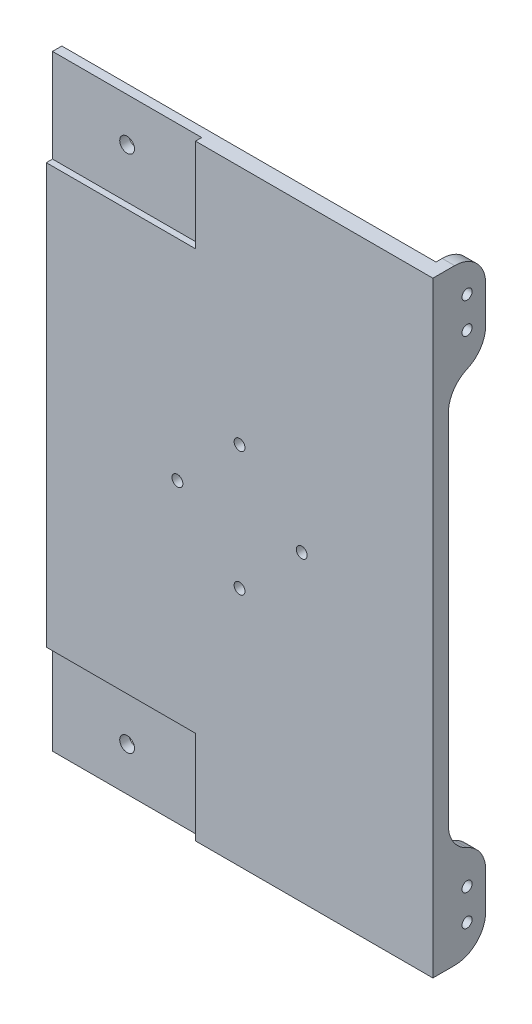
ISO-10303-21;
HEADER;
FILE_DESCRIPTION(('STEP AP214'),'2;1');
FILE_NAME('part.step','',(''),(''),'','','');
FILE_SCHEMA(('AUTOMOTIVE_DESIGN { 1 0 10303 214 1 1 1 1 }'));
ENDSEC;
DATA;
#1=APPLICATION_CONTEXT('core data for automotive mechanical design processes');
#2=APPLICATION_PROTOCOL_DEFINITION('international standard','automotive_design',2000,#1);
#3=PRODUCT_CONTEXT('',#1,'mechanical');
#4=PRODUCT('Part','Part','',(#3));
#5=PRODUCT_RELATED_PRODUCT_CATEGORY('part','',(#4));
#6=PRODUCT_DEFINITION_FORMATION('','',#4);
#7=PRODUCT_DEFINITION_CONTEXT('part definition',#1,'design');
#8=PRODUCT_DEFINITION('design','',#6,#7);
#9=PRODUCT_DEFINITION_SHAPE('','',#8);
#10=(LENGTH_UNIT() NAMED_UNIT(*) SI_UNIT(.MILLI.,.METRE.));
#11=(NAMED_UNIT(*) PLANE_ANGLE_UNIT() SI_UNIT($,.RADIAN.));
#12=(NAMED_UNIT(*) SI_UNIT($,.STERADIAN.) SOLID_ANGLE_UNIT());
#13=UNCERTAINTY_MEASURE_WITH_UNIT(LENGTH_MEASURE(1.E-05),#10,'distance_accuracy_value','');
#14=(GEOMETRIC_REPRESENTATION_CONTEXT(3) GLOBAL_UNCERTAINTY_ASSIGNED_CONTEXT((#13)) GLOBAL_UNIT_ASSIGNED_CONTEXT((#10,
#11,#12)) REPRESENTATION_CONTEXT('',''));
#15=CARTESIAN_POINT('',(0.,0.,0.));
#16=DIRECTION('',(0.,0.,1.));
#17=DIRECTION('',(1.,0.,0.));
#18=AXIS2_PLACEMENT_3D('',#15,#16,#17);
#19=CARTESIAN_POINT('',(-117.291706813187,97.76268,5.));
#20=DIRECTION('',(1.,0.,0.));
#21=DIRECTION('',(0.,1.,0.));
#22=AXIS2_PLACEMENT_3D('',#19,#20,#21);
#23=PLANE('',#22);
#24=DIRECTION('',(0.,-1.,0.));
#25=VECTOR('',#24,1.);
#26=CARTESIAN_POINT('',(-117.291706813187,97.76268,5.));
#27=LINE('',#26,#25);
#28=CARTESIAN_POINT('',(-117.291706813187,67.76268,5.));
#29=VERTEX_POINT('',#28);
#30=CARTESIAN_POINT('',(-117.291706813187,-67.23732,5.));
#31=VERTEX_POINT('',#30);
#32=EDGE_CURVE('E217',#29,#31,#27,.T.);
#33=ORIENTED_EDGE('',*,*,#32,.F.);
#34=DIRECTION('',(0.,0.,1.));
#35=VECTOR('',#34,1.);
#36=CARTESIAN_POINT('',(-117.291706813187,67.76268,3.));
#37=LINE('',#36,#35);
#38=CARTESIAN_POINT('',(-117.291706813187,67.76268,3.));
#39=VERTEX_POINT('',#38);
#40=EDGE_CURVE('E393',#39,#29,#37,.T.);
#41=ORIENTED_EDGE('',*,*,#40,.F.);
#42=DIRECTION('',(0.,-1.,0.));
#43=VECTOR('',#42,1.);
#44=CARTESIAN_POINT('',(-117.291706813187,67.76268,3.));
#45=LINE('',#44,#43);
#46=CARTESIAN_POINT('',(-117.291706813187,97.76268,3.));
#47=VERTEX_POINT('',#46);
#48=EDGE_CURVE('E410',#47,#39,#45,.T.);
#49=ORIENTED_EDGE('',*,*,#48,.F.);
#50=DIRECTION('',(0.,0.,-1.));
#51=VECTOR('',#50,1.);
#52=CARTESIAN_POINT('',(-117.291706813187,97.76268,5.));
#53=LINE('',#52,#51);
#54=CARTESIAN_POINT('',(-117.291706813187,97.76268,0.));
#55=VERTEX_POINT('',#54);
#56=EDGE_CURVE('E221',#47,#55,#53,.T.);
#57=ORIENTED_EDGE('',*,*,#56,.T.);
#58=DIRECTION('',(0.,-1.,0.));
#59=VECTOR('',#58,1.);
#60=CARTESIAN_POINT('',(-117.291706813187,97.76268,0.));
#61=LINE('',#60,#59);
#62=CARTESIAN_POINT('',(-117.291706813187,-97.23732,0.));
#63=VERTEX_POINT('',#62);
#64=EDGE_CURVE('E228',#55,#63,#61,.T.);
#65=ORIENTED_EDGE('',*,*,#64,.T.);
#66=DIRECTION('',(0.,0.,-1.));
#67=VECTOR('',#66,1.);
#68=CARTESIAN_POINT('',(-117.291706813187,-97.23732,5.));
#69=LINE('',#68,#67);
#70=CARTESIAN_POINT('',(-117.291706813187,-97.23732,3.));
#71=VERTEX_POINT('',#70);
#72=EDGE_CURVE('E242',#71,#63,#69,.T.);
#73=ORIENTED_EDGE('',*,*,#72,.F.);
#74=DIRECTION('',(0.,-1.,0.));
#75=VECTOR('',#74,1.);
#76=CARTESIAN_POINT('',(-117.291706813187,-67.23732,3.));
#77=LINE('',#76,#75);
#78=CARTESIAN_POINT('',(-117.291706813187,-67.23732,3.));
#79=VERTEX_POINT('',#78);
#80=EDGE_CURVE('E419',#79,#71,#77,.T.);
#81=ORIENTED_EDGE('',*,*,#80,.F.);
#82=DIRECTION('',(0.,0.,1.));
#83=VECTOR('',#82,1.);
#84=CARTESIAN_POINT('',(-117.291706813187,-67.23732,3.));
#85=LINE('',#84,#83);
#86=EDGE_CURVE('E233',#79,#31,#85,.T.);
#87=ORIENTED_EDGE('',*,*,#86,.T.);
#88=EDGE_LOOP('',(#33,#41,#49,#57,#65,#73,#81,#87));
#89=FACE_BOUND('',#88,.T.);
#90=ADVANCED_FACE('F45',(#89),#23,.F.);
#91=CARTESIAN_POINT('',(-117.291706813187,-97.23732,5.));
#92=DIRECTION('',(0.,1.,0.));
#93=DIRECTION('',(0.,0.,1.));
#94=AXIS2_PLACEMENT_3D('',#91,#92,#93);
#95=PLANE('',#94);
#96=DIRECTION('',(-1.,0.,0.));
#97=VECTOR('',#96,1.);
#98=CARTESIAN_POINT('',(-117.291706813187,-97.23732,-2.));
#99=LINE('',#98,#97);
#100=CARTESIAN_POINT('',(3.08829318681305,-97.23732,-2.));
#101=VERTEX_POINT('',#100);
#102=CARTESIAN_POINT('',(7.08829318681305,-97.23732,-2.));
#103=VERTEX_POINT('',#102);
#104=EDGE_CURVE('E206',#101,#103,#99,.F.);
#105=ORIENTED_EDGE('',*,*,#104,.T.);
#106=DIRECTION('',(0.,0.,-1.));
#107=VECTOR('',#106,1.);
#108=CARTESIAN_POINT('',(7.08829318681305,-97.23732,5.));
#109=LINE('',#108,#107);
#110=CARTESIAN_POINT('',(7.08829318681305,-97.23732,5.));
#111=VERTEX_POINT('',#110);
#112=EDGE_CURVE('E188',#111,#103,#109,.T.);
#113=ORIENTED_EDGE('',*,*,#112,.F.);
#114=DIRECTION('',(1.,0.,0.));
#115=VECTOR('',#114,1.);
#116=CARTESIAN_POINT('',(-117.291706813187,-97.23732,5.));
#117=LINE('',#116,#115);
#118=CARTESIAN_POINT('',(-69.2917068131869,-97.23732,5.));
#119=VERTEX_POINT('',#118);
#120=EDGE_CURVE('E203',#119,#111,#117,.T.);
#121=ORIENTED_EDGE('',*,*,#120,.F.);
#122=DIRECTION('',(0.,0.,1.));
#123=VECTOR('',#122,1.);
#124=CARTESIAN_POINT('',(-69.2917068131869,-97.23732,3.));
#125=LINE('',#124,#123);
#126=CARTESIAN_POINT('',(-69.2917068131869,-97.23732,3.));
#127=VERTEX_POINT('',#126);
#128=EDGE_CURVE('E435',#127,#119,#125,.T.);
#129=ORIENTED_EDGE('',*,*,#128,.F.);
#130=DIRECTION('',(1.,0.,0.));
#131=VECTOR('',#130,1.);
#132=CARTESIAN_POINT('',(-117.291706813187,-97.23732,3.));
#133=LINE('',#132,#131);
#134=EDGE_CURVE('E422',#71,#127,#133,.T.);
#135=ORIENTED_EDGE('',*,*,#134,.F.);
#136=ORIENTED_EDGE('',*,*,#72,.T.);
#137=DIRECTION('',(1.,0.,0.));
#138=VECTOR('',#137,1.);
#139=CARTESIAN_POINT('',(-117.291706813187,-97.23732,0.));
#140=LINE('',#139,#138);
#141=CARTESIAN_POINT('',(3.08829318681302,-97.23732,0.));
#142=VERTEX_POINT('',#141);
#143=EDGE_CURVE('E232',#63,#142,#140,.T.);
#144=ORIENTED_EDGE('',*,*,#143,.T.);
#145=DIRECTION('',(0.,0.,-1.));
#146=VECTOR('',#145,1.);
#147=CARTESIAN_POINT('',(3.08829318681305,-97.23732,0.));
#148=LINE('',#147,#146);
#149=EDGE_CURVE('E376',#142,#101,#148,.T.);
#150=ORIENTED_EDGE('',*,*,#149,.T.);
#151=EDGE_LOOP('',(#105,#113,#121,#129,#135,#136,#144,#150));
#152=FACE_BOUND('',#151,.T.);
#153=ADVANCED_FACE('F201',(#152),#95,.F.);
#154=CARTESIAN_POINT('',(-117.291706813187,97.76268,5.));
#155=DIRECTION('',(0.,-1.,0.));
#156=DIRECTION('',(0.,0.,-1.));
#157=AXIS2_PLACEMENT_3D('',#154,#155,#156);
#158=PLANE('',#157);
#159=DIRECTION('',(-1.,0.,0.));
#160=VECTOR('',#159,1.);
#161=CARTESIAN_POINT('',(-117.291706813187,97.76268,5.));
#162=LINE('',#161,#160);
#163=CARTESIAN_POINT('',(7.08829318681309,97.76268,5.));
#164=VERTEX_POINT('',#163);
#165=CARTESIAN_POINT('',(-69.2917068131869,97.76268,5.));
#166=VERTEX_POINT('',#165);
#167=EDGE_CURVE('E216',#164,#166,#162,.T.);
#168=ORIENTED_EDGE('',*,*,#167,.F.);
#169=DIRECTION('',(0.,0.,-1.));
#170=VECTOR('',#169,1.);
#171=CARTESIAN_POINT('',(7.08829318681309,97.76268,5.));
#172=LINE('',#171,#170);
#173=CARTESIAN_POINT('',(7.08829318681309,97.76268,-2.));
#174=VERTEX_POINT('',#173);
#175=EDGE_CURVE('E191',#164,#174,#172,.T.);
#176=ORIENTED_EDGE('',*,*,#175,.T.);
#177=DIRECTION('',(-1.,0.,0.));
#178=VECTOR('',#177,1.);
#179=CARTESIAN_POINT('',(-117.291706813187,97.76268,-2.));
#180=LINE('',#179,#178);
#181=CARTESIAN_POINT('',(3.08829318681309,97.76268,-2.));
#182=VERTEX_POINT('',#181);
#183=EDGE_CURVE('E299',#174,#182,#180,.T.);
#184=ORIENTED_EDGE('',*,*,#183,.T.);
#185=DIRECTION('',(0.,0.,1.));
#186=VECTOR('',#185,1.);
#187=CARTESIAN_POINT('',(3.08829318681309,97.76268,-12.));
#188=LINE('',#187,#186);
#189=CARTESIAN_POINT('',(3.08829318681309,97.76268,0.));
#190=VERTEX_POINT('',#189);
#191=EDGE_CURVE('E364',#182,#190,#188,.T.);
#192=ORIENTED_EDGE('',*,*,#191,.T.);
#193=DIRECTION('',(-1.,0.,0.));
#194=VECTOR('',#193,1.);
#195=CARTESIAN_POINT('',(-117.291706813187,97.76268,0.));
#196=LINE('',#195,#194);
#197=EDGE_CURVE('E224',#190,#55,#196,.T.);
#198=ORIENTED_EDGE('',*,*,#197,.T.);
#199=ORIENTED_EDGE('',*,*,#56,.F.);
#200=DIRECTION('',(-1.,0.,0.));
#201=VECTOR('',#200,1.);
#202=CARTESIAN_POINT('',(-117.291706813187,97.76268,3.));
#203=LINE('',#202,#201);
#204=CARTESIAN_POINT('',(-69.2917068131869,97.76268,3.));
#205=VERTEX_POINT('',#204);
#206=EDGE_CURVE('E413',#205,#47,#203,.T.);
#207=ORIENTED_EDGE('',*,*,#206,.F.);
#208=DIRECTION('',(0.,0.,1.));
#209=VECTOR('',#208,1.);
#210=CARTESIAN_POINT('',(-69.2917068131869,97.76268,3.));
#211=LINE('',#210,#209);
#212=EDGE_CURVE('E388',#205,#166,#211,.T.);
#213=ORIENTED_EDGE('',*,*,#212,.T.);
#214=EDGE_LOOP('',(#168,#176,#184,#192,#198,#199,#207,#213));
#215=FACE_BOUND('',#214,.T.);
#216=ADVANCED_FACE('F538',(#215),#158,.F.);
#217=CARTESIAN_POINT('',(0.,0.,5.));
#218=DIRECTION('',(0.,0.,1.));
#219=DIRECTION('',(1.,0.,0.));
#220=AXIS2_PLACEMENT_3D('',#217,#218,#219);
#221=PLANE('',#220);
#222=DIRECTION('',(0.,1.,0.));
#223=VECTOR('',#222,1.);
#224=CARTESIAN_POINT('',(7.08829318681309,97.76268,5.));
#225=LINE('',#224,#223);
#226=EDGE_CURVE('E184',#111,#164,#225,.T.);
#227=ORIENTED_EDGE('',*,*,#226,.T.);
#228=ORIENTED_EDGE('',*,*,#167,.T.);
#229=DIRECTION('',(0.,1.,0.));
#230=VECTOR('',#229,1.);
#231=CARTESIAN_POINT('',(-69.2917068131869,97.76268,5.));
#232=LINE('',#231,#230);
#233=CARTESIAN_POINT('',(-69.2917068131869,67.76268,5.));
#234=VERTEX_POINT('',#233);
#235=EDGE_CURVE('E402',#234,#166,#232,.T.);
#236=ORIENTED_EDGE('',*,*,#235,.F.);
#237=DIRECTION('',(1.,0.,0.));
#238=VECTOR('',#237,1.);
#239=CARTESIAN_POINT('',(-69.2917068131869,67.76268,5.));
#240=LINE('',#239,#238);
#241=EDGE_CURVE('E398',#29,#234,#240,.T.);
#242=ORIENTED_EDGE('',*,*,#241,.F.);
#243=ORIENTED_EDGE('',*,*,#32,.T.);
#244=DIRECTION('',(-1.,0.,0.));
#245=VECTOR('',#244,1.);
#246=CARTESIAN_POINT('',(-69.2917068131869,-67.23732,5.));
#247=LINE('',#246,#245);
#248=CARTESIAN_POINT('',(-69.2917068131869,-67.23732,5.));
#249=VERTEX_POINT('',#248);
#250=EDGE_CURVE('E423',#249,#31,#247,.T.);
#251=ORIENTED_EDGE('',*,*,#250,.F.);
#252=DIRECTION('',(0.,1.,0.));
#253=VECTOR('',#252,1.);
#254=CARTESIAN_POINT('',(-69.2917068131869,-97.23732,5.));
#255=LINE('',#254,#253);
#256=EDGE_CURVE('E214',#119,#249,#255,.T.);
#257=ORIENTED_EDGE('',*,*,#256,.F.);
#258=ORIENTED_EDGE('',*,*,#120,.T.);
#259=EDGE_LOOP('',(#227,#228,#236,#242,#243,#251,#257,#258));
#260=FACE_BOUND('',#259,.T.);
#261=CARTESIAN_POINT('',(-55.1017068131869,20.26268,5.));
#262=DIRECTION('',(0.,0.,1.));
#263=DIRECTION('',(1.,0.,0.));
#264=AXIS2_PLACEMENT_3D('',#261,#262,#263);
#265=CIRCLE('',#264,1.75);
#266=CARTESIAN_POINT('',(-53.3517068131869,20.26268,5.));
#267=VERTEX_POINT('',#266);
#268=EDGE_CURVE('E309',#267,#267,#265,.T.);
#269=ORIENTED_EDGE('',*,*,#268,.F.);
#270=EDGE_LOOP('',(#269));
#271=FACE_BOUND('',#270,.T.);
#272=CARTESIAN_POINT('',(-35.1017068131875,0.26268000000033,5.));
#273=DIRECTION('',(0.,0.,1.));
#274=DIRECTION('',(1.,0.,0.));
#275=AXIS2_PLACEMENT_3D('',#272,#273,#274);
#276=CIRCLE('',#275,1.75000000000019);
#277=CARTESIAN_POINT('',(-33.3517068131873,0.26268000000033,5.));
#278=VERTEX_POINT('',#277);
#279=EDGE_CURVE('E353',#278,#278,#276,.T.);
#280=ORIENTED_EDGE('',*,*,#279,.F.);
#281=EDGE_LOOP('',(#280));
#282=FACE_BOUND('',#281,.T.);
#283=CARTESIAN_POINT('',(-55.1017068131866,-19.7373199999994,5.));
#284=DIRECTION('',(0.,0.,1.));
#285=DIRECTION('',(1.,0.,0.));
#286=AXIS2_PLACEMENT_3D('',#283,#284,#285);
#287=CIRCLE('',#286,1.74999999999955);
#288=CARTESIAN_POINT('',(-53.351706813187,-19.7373199999994,5.));
#289=VERTEX_POINT('',#288);
#290=EDGE_CURVE('E357',#289,#289,#287,.T.);
#291=ORIENTED_EDGE('',*,*,#290,.F.);
#292=EDGE_LOOP('',(#291));
#293=FACE_BOUND('',#292,.T.);
#294=CARTESIAN_POINT('',(-75.1017068131863,0.262679999999647,5.));
#295=DIRECTION('',(0.,0.,1.));
#296=DIRECTION('',(1.,0.,0.));
#297=AXIS2_PLACEMENT_3D('',#294,#295,#296);
#298=CIRCLE('',#297,1.75);
#299=CARTESIAN_POINT('',(-73.3517068131863,0.262679999999647,5.));
#300=VERTEX_POINT('',#299);
#301=EDGE_CURVE('E349',#300,#300,#298,.T.);
#302=ORIENTED_EDGE('',*,*,#301,.F.);
#303=EDGE_LOOP('',(#302));
#304=FACE_BOUND('',#303,.T.);
#305=ADVANCED_FACE('F210',(#260,#271,#282,#293,#304),#221,.T.);
#306=CARTESIAN_POINT('',(0.,0.,0.));
#307=DIRECTION('',(0.,0.,1.));
#308=DIRECTION('',(1.,0.,0.));
#309=AXIS2_PLACEMENT_3D('',#306,#307,#308);
#310=PLANE('',#309);
#311=DIRECTION('',(-1.,0.,0.));
#312=VECTOR('',#311,1.);
#313=CARTESIAN_POINT('',(11.0882931868131,57.76268,0.));
#314=LINE('',#313,#312);
#315=CARTESIAN_POINT('',(3.08829318681308,57.76268,0.));
#316=VERTEX_POINT('',#315);
#317=CARTESIAN_POINT('',(7.08829318681308,57.76268,0.));
#318=VERTEX_POINT('',#317);
#319=EDGE_CURVE('E245',#316,#318,#314,.F.);
#320=ORIENTED_EDGE('',*,*,#319,.T.);
#321=DIRECTION('',(0.,-1.,0.));
#322=VECTOR('',#321,1.);
#323=CARTESIAN_POINT('',(7.08829318681307,0.,0.));
#324=LINE('',#323,#322);
#325=CARTESIAN_POINT('',(7.08829318681305,-57.23732,0.));
#326=VERTEX_POINT('',#325);
#327=EDGE_CURVE('E338',#318,#326,#324,.T.);
#328=ORIENTED_EDGE('',*,*,#327,.T.);
#329=DIRECTION('',(-1.,0.,0.));
#330=VECTOR('',#329,1.);
#331=CARTESIAN_POINT('',(3.08829318681305,-57.23732,0.));
#332=LINE('',#331,#330);
#333=CARTESIAN_POINT('',(3.08829318681305,-57.23732,0.));
#334=VERTEX_POINT('',#333);
#335=EDGE_CURVE('E260',#326,#334,#332,.T.);
#336=ORIENTED_EDGE('',*,*,#335,.T.);
#337=DIRECTION('',(0.,-1.,0.));
#338=VECTOR('',#337,1.);
#339=CARTESIAN_POINT('',(3.08829318681305,-67.23732,0.));
#340=LINE('',#339,#338);
#341=EDGE_CURVE('E368',#334,#142,#340,.T.);
#342=ORIENTED_EDGE('',*,*,#341,.T.);
#343=ORIENTED_EDGE('',*,*,#143,.F.);
#344=ORIENTED_EDGE('',*,*,#64,.F.);
#345=ORIENTED_EDGE('',*,*,#197,.F.);
#346=DIRECTION('',(0.,-1.,0.));
#347=VECTOR('',#346,1.);
#348=CARTESIAN_POINT('',(3.08829318681309,97.76268,0.));
#349=LINE('',#348,#347);
#350=EDGE_CURVE('E367',#190,#316,#349,.T.);
#351=ORIENTED_EDGE('',*,*,#350,.T.);
#352=EDGE_LOOP('',(#320,#328,#336,#342,#343,#344,#345,#351));
#353=FACE_BOUND('',#352,.T.);
#354=CARTESIAN_POINT('',(-93.2917068131869,83.76268,0.));
#355=DIRECTION('',(0.,0.,1.));
#356=DIRECTION('',(1.,0.,0.));
#357=AXIS2_PLACEMENT_3D('',#354,#355,#356);
#358=CIRCLE('',#357,2.375);
#359=CARTESIAN_POINT('',(-90.9167068131869,83.76268,0.));
#360=VERTEX_POINT('',#359);
#361=EDGE_CURVE('E250',#360,#360,#358,.T.);
#362=ORIENTED_EDGE('',*,*,#361,.T.);
#363=EDGE_LOOP('',(#362));
#364=FACE_BOUND('',#363,.T.);
#365=CARTESIAN_POINT('',(-93.2917068131869,-83.23732,0.));
#366=DIRECTION('',(0.,0.,1.));
#367=DIRECTION('',(1.,0.,0.));
#368=AXIS2_PLACEMENT_3D('',#365,#366,#367);
#369=CIRCLE('',#368,2.375);
#370=CARTESIAN_POINT('',(-90.9167068131869,-83.23732,0.));
#371=VERTEX_POINT('',#370);
#372=EDGE_CURVE('E256',#371,#371,#369,.T.);
#373=ORIENTED_EDGE('',*,*,#372,.T.);
#374=EDGE_LOOP('',(#373));
#375=FACE_BOUND('',#374,.T.);
#376=CARTESIAN_POINT('',(-75.1017068131863,0.262679999999647,0.));
#377=DIRECTION('',(0.,0.,1.));
#378=DIRECTION('',(1.,0.,0.));
#379=AXIS2_PLACEMENT_3D('',#376,#377,#378);
#380=CIRCLE('',#379,1.75);
#381=CARTESIAN_POINT('',(-73.3517068131863,0.262679999999647,0.));
#382=VERTEX_POINT('',#381);
#383=EDGE_CURVE('E345',#382,#382,#380,.F.);
#384=ORIENTED_EDGE('',*,*,#383,.F.);
#385=EDGE_LOOP('',(#384));
#386=FACE_BOUND('',#385,.T.);
#387=CARTESIAN_POINT('',(-35.1017068131875,0.26268000000033,0.));
#388=DIRECTION('',(0.,0.,1.));
#389=DIRECTION('',(1.,0.,0.));
#390=AXIS2_PLACEMENT_3D('',#387,#388,#389);
#391=CIRCLE('',#390,1.75000000000019);
#392=CARTESIAN_POINT('',(-33.3517068131873,0.26268000000033,0.));
#393=VERTEX_POINT('',#392);
#394=EDGE_CURVE('E324',#393,#393,#391,.F.);
#395=ORIENTED_EDGE('',*,*,#394,.F.);
#396=EDGE_LOOP('',(#395));
#397=FACE_BOUND('',#396,.T.);
#398=CARTESIAN_POINT('',(-55.1017068131869,20.26268,0.));
#399=DIRECTION('',(0.,0.,1.));
#400=DIRECTION('',(1.,0.,0.));
#401=AXIS2_PLACEMENT_3D('',#398,#399,#400);
#402=CIRCLE('',#401,1.75);
#403=CARTESIAN_POINT('',(-53.3517068131869,20.26268,0.));
#404=VERTEX_POINT('',#403);
#405=EDGE_CURVE('E321',#404,#404,#402,.F.);
#406=ORIENTED_EDGE('',*,*,#405,.F.);
#407=EDGE_LOOP('',(#406));
#408=FACE_BOUND('',#407,.T.);
#409=CARTESIAN_POINT('',(-55.1017068131866,-19.7373199999994,0.));
#410=DIRECTION('',(0.,0.,1.));
#411=DIRECTION('',(1.,0.,0.));
#412=AXIS2_PLACEMENT_3D('',#409,#410,#411);
#413=CIRCLE('',#412,1.74999999999955);
#414=CARTESIAN_POINT('',(-53.351706813187,-19.7373199999994,0.));
#415=VERTEX_POINT('',#414);
#416=EDGE_CURVE('E331',#415,#415,#413,.F.);
#417=ORIENTED_EDGE('',*,*,#416,.F.);
#418=EDGE_LOOP('',(#417));
#419=FACE_BOUND('',#418,.T.);
#420=ADVANCED_FACE('F460',(#353,#364,#375,#386,#397,#408,#419),#310,.F.);
#421=CARTESIAN_POINT('',(-69.2917068131869,-67.23732,3.));
#422=DIRECTION('',(0.,1.,0.));
#423=DIRECTION('',(0.,0.,1.));
#424=AXIS2_PLACEMENT_3D('',#421,#422,#423);
#425=PLANE('',#424);
#426=ORIENTED_EDGE('',*,*,#250,.T.);
#427=ORIENTED_EDGE('',*,*,#86,.F.);
#428=DIRECTION('',(-1.,0.,0.));
#429=VECTOR('',#428,1.);
#430=CARTESIAN_POINT('',(-69.2917068131869,-67.23732,3.));
#431=LINE('',#430,#429);
#432=CARTESIAN_POINT('',(-69.2917068131869,-67.23732,3.));
#433=VERTEX_POINT('',#432);
#434=EDGE_CURVE('E431',#433,#79,#431,.T.);
#435=ORIENTED_EDGE('',*,*,#434,.F.);
#436=DIRECTION('',(0.,0.,1.));
#437=VECTOR('',#436,1.);
#438=CARTESIAN_POINT('',(-69.2917068131869,-67.23732,3.));
#439=LINE('',#438,#437);
#440=EDGE_CURVE('E443',#433,#249,#439,.T.);
#441=ORIENTED_EDGE('',*,*,#440,.T.);
#442=EDGE_LOOP('',(#426,#427,#435,#441));
#443=FACE_BOUND('',#442,.T.);
#444=ADVANCED_FACE('F585',(#443),#425,.F.);
#445=CARTESIAN_POINT('',(-69.2917068131869,-97.23732,3.));
#446=DIRECTION('',(1.,0.,0.));
#447=DIRECTION('',(0.,0.,-1.));
#448=AXIS2_PLACEMENT_3D('',#445,#446,#447);
#449=PLANE('',#448);
#450=ORIENTED_EDGE('',*,*,#256,.T.);
#451=ORIENTED_EDGE('',*,*,#440,.F.);
#452=DIRECTION('',(0.,1.,0.));
#453=VECTOR('',#452,1.);
#454=CARTESIAN_POINT('',(-69.2917068131869,-97.23732,3.));
#455=LINE('',#454,#453);
#456=EDGE_CURVE('E427',#127,#433,#455,.T.);
#457=ORIENTED_EDGE('',*,*,#456,.F.);
#458=ORIENTED_EDGE('',*,*,#128,.T.);
#459=EDGE_LOOP('',(#450,#451,#457,#458));
#460=FACE_BOUND('',#459,.T.);
#461=ADVANCED_FACE('F447',(#460),#449,.F.);
#462=CARTESIAN_POINT('',(0.,0.,3.));
#463=DIRECTION('',(0.,0.,1.));
#464=DIRECTION('',(1.,0.,0.));
#465=AXIS2_PLACEMENT_3D('',#462,#463,#464);
#466=PLANE('',#465);
#467=CARTESIAN_POINT('',(-93.2917068131869,-83.23732,3.));
#468=DIRECTION('',(0.,0.,1.));
#469=DIRECTION('',(1.,0.,0.));
#470=AXIS2_PLACEMENT_3D('',#467,#468,#469);
#471=CIRCLE('',#470,2.375);
#472=CARTESIAN_POINT('',(-90.9167068131869,-83.23732,3.));
#473=VERTEX_POINT('',#472);
#474=EDGE_CURVE('E252',#473,#473,#471,.T.);
#475=ORIENTED_EDGE('',*,*,#474,.F.);
#476=EDGE_LOOP('',(#475));
#477=FACE_BOUND('',#476,.T.);
#478=ORIENTED_EDGE('',*,*,#80,.T.);
#479=ORIENTED_EDGE('',*,*,#134,.T.);
#480=ORIENTED_EDGE('',*,*,#456,.T.);
#481=ORIENTED_EDGE('',*,*,#434,.T.);
#482=EDGE_LOOP('',(#478,#479,#480,#481));
#483=FACE_BOUND('',#482,.T.);
#484=ADVANCED_FACE('F586',(#477,#483),#466,.T.);
#485=CARTESIAN_POINT('',(-69.2917068131869,97.76268,3.));
#486=DIRECTION('',(1.,0.,0.));
#487=DIRECTION('',(0.,0.,-1.));
#488=AXIS2_PLACEMENT_3D('',#485,#486,#487);
#489=PLANE('',#488);
#490=ORIENTED_EDGE('',*,*,#235,.T.);
#491=ORIENTED_EDGE('',*,*,#212,.F.);
#492=DIRECTION('',(0.,1.,0.));
#493=VECTOR('',#492,1.);
#494=CARTESIAN_POINT('',(-69.2917068131869,97.76268,3.));
#495=LINE('',#494,#493);
#496=CARTESIAN_POINT('',(-69.2917068131869,67.76268,3.));
#497=VERTEX_POINT('',#496);
#498=EDGE_CURVE('E403',#497,#205,#495,.T.);
#499=ORIENTED_EDGE('',*,*,#498,.F.);
#500=DIRECTION('',(0.,0.,1.));
#501=VECTOR('',#500,1.);
#502=CARTESIAN_POINT('',(-69.2917068131869,67.76268,3.));
#503=LINE('',#502,#501);
#504=EDGE_CURVE('E387',#497,#234,#503,.T.);
#505=ORIENTED_EDGE('',*,*,#504,.T.);
#506=EDGE_LOOP('',(#490,#491,#499,#505));
#507=FACE_BOUND('',#506,.T.);
#508=ADVANCED_FACE('F577',(#507),#489,.F.);
#509=CARTESIAN_POINT('',(-69.2917068131869,67.76268,3.));
#510=DIRECTION('',(0.,-1.,0.));
#511=DIRECTION('',(0.,0.,-1.));
#512=AXIS2_PLACEMENT_3D('',#509,#510,#511);
#513=PLANE('',#512);
#514=ORIENTED_EDGE('',*,*,#241,.T.);
#515=ORIENTED_EDGE('',*,*,#504,.F.);
#516=DIRECTION('',(1.,0.,0.));
#517=VECTOR('',#516,1.);
#518=CARTESIAN_POINT('',(-69.2917068131869,67.76268,3.));
#519=LINE('',#518,#517);
#520=EDGE_CURVE('E392',#39,#497,#519,.T.);
#521=ORIENTED_EDGE('',*,*,#520,.F.);
#522=ORIENTED_EDGE('',*,*,#40,.T.);
#523=EDGE_LOOP('',(#514,#515,#521,#522));
#524=FACE_BOUND('',#523,.T.);
#525=ADVANCED_FACE('F581',(#524),#513,.F.);
#526=CARTESIAN_POINT('',(0.,0.,3.));
#527=DIRECTION('',(0.,0.,-1.));
#528=DIRECTION('',(-1.,0.,0.));
#529=AXIS2_PLACEMENT_3D('',#526,#527,#528);
#530=PLANE('',#529);
#531=CARTESIAN_POINT('',(-93.2917068131869,83.76268,3.));
#532=DIRECTION('',(0.,0.,-1.));
#533=DIRECTION('',(-1.,0.,0.));
#534=AXIS2_PLACEMENT_3D('',#531,#532,#533);
#535=CIRCLE('',#534,2.375);
#536=CARTESIAN_POINT('',(-95.6667068131869,83.76268,3.));
#537=VERTEX_POINT('',#536);
#538=EDGE_CURVE('E246',#537,#537,#535,.T.);
#539=ORIENTED_EDGE('',*,*,#538,.T.);
#540=EDGE_LOOP('',(#539));
#541=FACE_BOUND('',#540,.T.);
#542=ORIENTED_EDGE('',*,*,#498,.T.);
#543=ORIENTED_EDGE('',*,*,#206,.T.);
#544=ORIENTED_EDGE('',*,*,#48,.T.);
#545=ORIENTED_EDGE('',*,*,#520,.T.);
#546=EDGE_LOOP('',(#542,#543,#544,#545));
#547=FACE_BOUND('',#546,.T.);
#548=ADVANCED_FACE('F601',(#541,#547),#530,.F.);
#549=CARTESIAN_POINT('',(-93.2917068131869,83.76268,-5.));
#550=DIRECTION('',(0.,0.,1.));
#551=DIRECTION('',(1.,0.,0.));
#552=AXIS2_PLACEMENT_3D('',#549,#550,#551);
#553=CYLINDRICAL_SURFACE('',#552,2.375);
#554=ORIENTED_EDGE('',*,*,#538,.F.);
#555=EDGE_LOOP('',(#554));
#556=FACE_BOUND('',#555,.T.);
#557=ORIENTED_EDGE('',*,*,#361,.F.);
#558=EDGE_LOOP('',(#557));
#559=FACE_BOUND('',#558,.T.);
#560=ADVANCED_FACE('F754',(#556,#559),#553,.F.);
#561=CARTESIAN_POINT('',(-93.2917068131869,-83.23732,-5.));
#562=DIRECTION('',(0.,0.,1.));
#563=DIRECTION('',(1.,0.,0.));
#564=AXIS2_PLACEMENT_3D('',#561,#562,#563);
#565=CYLINDRICAL_SURFACE('',#564,2.375);
#566=ORIENTED_EDGE('',*,*,#474,.T.);
#567=EDGE_LOOP('',(#566));
#568=FACE_BOUND('',#567,.T.);
#569=ORIENTED_EDGE('',*,*,#372,.F.);
#570=EDGE_LOOP('',(#569));
#571=FACE_BOUND('',#570,.T.);
#572=ADVANCED_FACE('F630',(#568,#571),#565,.F.);
#573=CARTESIAN_POINT('',(11.088293186813,-97.23732,-12.));
#574=DIRECTION('',(0.,0.,1.));
#575=DIRECTION('',(1.,0.,0.));
#576=AXIS2_PLACEMENT_3D('',#573,#574,#575);
#577=PLANE('',#576);
#578=DIRECTION('',(1.,0.,0.));
#579=VECTOR('',#578,1.);
#580=CARTESIAN_POINT('',(11.0882931868131,-75.5676227798234,-12.));
#581=LINE('',#580,#579);
#582=CARTESIAN_POINT('',(3.08829318681305,-75.5676227798234,-12.));
#583=VERTEX_POINT('',#582);
#584=CARTESIAN_POINT('',(7.08829318681305,-75.5676227798234,-12.));
#585=VERTEX_POINT('',#584);
#586=EDGE_CURVE('E287',#583,#585,#581,.T.);
#587=ORIENTED_EDGE('',*,*,#586,.T.);
#588=DIRECTION('',(0.,1.,0.));
#589=VECTOR('',#588,1.);
#590=CARTESIAN_POINT('',(7.08829318681309,97.76268,-12.));
#591=LINE('',#590,#589);
#592=CARTESIAN_POINT('',(7.08829318681305,-87.23732,-12.));
#593=VERTEX_POINT('',#592);
#594=EDGE_CURVE('E196',#593,#585,#591,.T.);
#595=ORIENTED_EDGE('',*,*,#594,.F.);
#596=DIRECTION('',(-1.,0.,0.));
#597=VECTOR('',#596,1.);
#598=CARTESIAN_POINT('',(11.088293186813,-87.23732,-12.));
#599=LINE('',#598,#597);
#600=CARTESIAN_POINT('',(3.08829318681305,-87.23732,-12.));
#601=VERTEX_POINT('',#600);
#602=EDGE_CURVE('E291',#593,#601,#599,.T.);
#603=ORIENTED_EDGE('',*,*,#602,.T.);
#604=DIRECTION('',(0.,1.,0.));
#605=VECTOR('',#604,1.);
#606=CARTESIAN_POINT('',(3.08829318681305,-97.23732,-12.));
#607=LINE('',#606,#605);
#608=EDGE_CURVE('E320',#601,#583,#607,.T.);
#609=ORIENTED_EDGE('',*,*,#608,.T.);
#610=EDGE_LOOP('',(#587,#595,#603,#609));
#611=FACE_BOUND('',#610,.T.);
#612=ADVANCED_FACE('F502',(#611),#577,.F.);
#613=CARTESIAN_POINT('',(3.08829318681307,0.,0.));
#614=DIRECTION('',(1.,0.,0.));
#615=DIRECTION('',(0.,1.,0.));
#616=AXIS2_PLACEMENT_3D('',#613,#614,#615);
#617=PLANE('',#616);
#618=CARTESIAN_POINT('',(3.08829318681306,-77.23732,-6.00000000000001));
#619=DIRECTION('',(1.,0.,0.));
#620=DIRECTION('',(0.,1.,0.));
#621=AXIS2_PLACEMENT_3D('',#618,#619,#620);
#622=CIRCLE('',#621,1.625);
#623=CARTESIAN_POINT('',(3.08829318681306,-75.61232,-6.00000000000001));
#624=VERTEX_POINT('',#623);
#625=EDGE_CURVE('E317',#624,#624,#622,.T.);
#626=ORIENTED_EDGE('',*,*,#625,.T.);
#627=EDGE_LOOP('',(#626));
#628=FACE_BOUND('',#627,.T.);
#629=CARTESIAN_POINT('',(3.08829318681306,-87.2373200000001,-6.00000000000001));
#630=DIRECTION('',(1.,0.,0.));
#631=DIRECTION('',(0.,1.,0.));
#632=AXIS2_PLACEMENT_3D('',#629,#630,#631);
#633=CIRCLE('',#632,1.625);
#634=CARTESIAN_POINT('',(3.08829318681306,-85.6123200000001,-6.00000000000001));
#635=VERTEX_POINT('',#634);
#636=EDGE_CURVE('E313',#635,#635,#633,.T.);
#637=ORIENTED_EDGE('',*,*,#636,.T.);
#638=EDGE_LOOP('',(#637));
#639=FACE_BOUND('',#638,.T.);
#640=ORIENTED_EDGE('',*,*,#608,.F.);
#641=CARTESIAN_POINT('',(3.08829318681305,-87.23732,-2.));
#642=DIRECTION('',(1.,0.,0.));
#643=DIRECTION('',(0.,1.,0.));
#644=AXIS2_PLACEMENT_3D('',#641,#642,#643);
#645=CIRCLE('',#644,10.);
#646=EDGE_CURVE('E294',#601,#101,#645,.F.);
#647=ORIENTED_EDGE('',*,*,#646,.T.);
#648=ORIENTED_EDGE('',*,*,#149,.F.);
#649=ORIENTED_EDGE('',*,*,#341,.F.);
#650=CARTESIAN_POINT('',(3.08829318681305,-57.23732,-10.));
#651=DIRECTION('',(1.,0.,0.));
#652=DIRECTION('',(0.,1.,0.));
#653=AXIS2_PLACEMENT_3D('',#650,#651,#652);
#654=CIRCLE('',#653,10.);
#655=CARTESIAN_POINT('',(3.08829318681305,-66.4024713899117,-6.));
#656=VERTEX_POINT('',#655);
#657=EDGE_CURVE('E263',#334,#656,#654,.T.);
#658=ORIENTED_EDGE('',*,*,#657,.T.);
#659=CARTESIAN_POINT('',(3.08829318681305,-75.5676227798234,-2.));
#660=DIRECTION('',(1.,0.,0.));
#661=DIRECTION('',(0.,1.,0.));
#662=AXIS2_PLACEMENT_3D('',#659,#660,#661);
#663=CIRCLE('',#662,10.);
#664=EDGE_CURVE('E283',#656,#583,#663,.F.);
#665=ORIENTED_EDGE('',*,*,#664,.T.);
#666=EDGE_LOOP('',(#640,#647,#648,#649,#658,#665));
#667=FACE_BOUND('',#666,.T.);
#668=ADVANCED_FACE('F467',(#628,#639,#667),#617,.F.);
#669=CARTESIAN_POINT('',(11.0882931868131,67.76268,-12.));
#670=DIRECTION('',(0.,0.,1.));
#671=DIRECTION('',(0.,-1.,0.));
#672=AXIS2_PLACEMENT_3D('',#669,#670,#671);
#673=PLANE('',#672);
#674=DIRECTION('',(-1.,0.,0.));
#675=VECTOR('',#674,1.);
#676=CARTESIAN_POINT('',(11.0882931868131,87.76268,-12.));
#677=LINE('',#676,#675);
#678=CARTESIAN_POINT('',(3.08829318681309,87.76268,-12.));
#679=VERTEX_POINT('',#678);
#680=CARTESIAN_POINT('',(7.08829318681307,87.76268,-12.));
#681=VERTEX_POINT('',#680);
#682=EDGE_CURVE('E11',#679,#681,#677,.F.);
#683=ORIENTED_EDGE('',*,*,#682,.T.);
#684=CARTESIAN_POINT('',(7.08829318681308,76.0929827798233,-12.));
#685=VERTEX_POINT('',#684);
#686=EDGE_CURVE('E63',#685,#681,#591,.T.);
#687=ORIENTED_EDGE('',*,*,#686,.F.);
#688=DIRECTION('',(1.,0.,0.));
#689=VECTOR('',#688,1.);
#690=CARTESIAN_POINT('',(11.0882931868131,76.0929827798233,-12.));
#691=LINE('',#690,#689);
#692=CARTESIAN_POINT('',(3.08829318681308,76.0929827798233,-12.));
#693=VERTEX_POINT('',#692);
#694=EDGE_CURVE('E270',#685,#693,#691,.F.);
#695=ORIENTED_EDGE('',*,*,#694,.T.);
#696=DIRECTION('',(0.,1.,0.));
#697=VECTOR('',#696,1.);
#698=CARTESIAN_POINT('',(3.08829318681308,67.76268,-12.));
#699=LINE('',#698,#697);
#700=EDGE_CURVE('E251',#693,#679,#699,.T.);
#701=ORIENTED_EDGE('',*,*,#700,.T.);
#702=EDGE_LOOP('',(#683,#687,#695,#701));
#703=FACE_BOUND('',#702,.T.);
#704=ADVANCED_FACE('F567',(#703),#673,.F.);
#705=CARTESIAN_POINT('',(3.08829318681307,0.,0.));
#706=DIRECTION('',(1.,0.,0.));
#707=DIRECTION('',(0.,1.,0.));
#708=AXIS2_PLACEMENT_3D('',#705,#706,#707);
#709=PLANE('',#708);
#710=CARTESIAN_POINT('',(3.08829318681308,87.76268,-6.00000000000001));
#711=DIRECTION('',(1.,0.,0.));
#712=DIRECTION('',(0.,1.,0.));
#713=AXIS2_PLACEMENT_3D('',#710,#711,#712);
#714=CIRCLE('',#713,1.625);
#715=CARTESIAN_POINT('',(3.08829318681309,89.38768,-6.00000000000001));
#716=VERTEX_POINT('',#715);
#717=EDGE_CURVE('E308',#716,#716,#714,.T.);
#718=ORIENTED_EDGE('',*,*,#717,.T.);
#719=EDGE_LOOP('',(#718));
#720=FACE_BOUND('',#719,.T.);
#721=CARTESIAN_POINT('',(3.08829318681308,77.76268,-6.00000000000001));
#722=DIRECTION('',(1.,0.,0.));
#723=DIRECTION('',(0.,1.,0.));
#724=AXIS2_PLACEMENT_3D('',#721,#722,#723);
#725=CIRCLE('',#724,1.625);
#726=CARTESIAN_POINT('',(3.08829318681309,79.38768,-6.00000000000001));
#727=VERTEX_POINT('',#726);
#728=EDGE_CURVE('E304',#727,#727,#725,.T.);
#729=ORIENTED_EDGE('',*,*,#728,.T.);
#730=EDGE_LOOP('',(#729));
#731=FACE_BOUND('',#730,.T.);
#732=ORIENTED_EDGE('',*,*,#191,.F.);
#733=CARTESIAN_POINT('',(3.08829318681308,87.76268,-2.));
#734=DIRECTION('',(1.,0.,0.));
#735=DIRECTION('',(0.,1.,0.));
#736=AXIS2_PLACEMENT_3D('',#733,#734,#735);
#737=CIRCLE('',#736,10.);
#738=EDGE_CURVE('E55',#182,#679,#737,.F.);
#739=ORIENTED_EDGE('',*,*,#738,.T.);
#740=ORIENTED_EDGE('',*,*,#700,.F.);
#741=CARTESIAN_POINT('',(3.08829318681308,76.0929827798233,-2.));
#742=DIRECTION('',(1.,0.,0.));
#743=DIRECTION('',(0.,1.,0.));
#744=AXIS2_PLACEMENT_3D('',#741,#742,#743);
#745=CIRCLE('',#744,10.);
#746=CARTESIAN_POINT('',(3.08829318681308,66.9278313899117,-6.));
#747=VERTEX_POINT('',#746);
#748=EDGE_CURVE('E273',#693,#747,#745,.F.);
#749=ORIENTED_EDGE('',*,*,#748,.T.);
#750=CARTESIAN_POINT('',(3.08829318681308,57.76268,-10.));
#751=DIRECTION('',(1.,0.,0.));
#752=DIRECTION('',(0.,1.,0.));
#753=AXIS2_PLACEMENT_3D('',#750,#751,#752);
#754=CIRCLE('',#753,10.);
#755=EDGE_CURVE('E267',#747,#316,#754,.T.);
#756=ORIENTED_EDGE('',*,*,#755,.T.);
#757=ORIENTED_EDGE('',*,*,#350,.F.);
#758=EDGE_LOOP('',(#732,#739,#740,#749,#756,#757));
#759=FACE_BOUND('',#758,.T.);
#760=ADVANCED_FACE('F545',(#720,#731,#759),#709,.F.);
#761=CARTESIAN_POINT('',(0.,-57.23732,-10.));
#762=DIRECTION('',(1.,0.,0.));
#763=DIRECTION('',(0.,1.,0.));
#764=AXIS2_PLACEMENT_3D('',#761,#762,#763);
#765=CYLINDRICAL_SURFACE('',#764,10.);
#766=ORIENTED_EDGE('',*,*,#335,.F.);
#767=CARTESIAN_POINT('',(7.08829318681305,-57.23732,-10.));
#768=DIRECTION('',(-1.,0.,0.));
#769=DIRECTION('',(0.,-1.,0.));
#770=AXIS2_PLACEMENT_3D('',#767,#768,#769);
#771=CIRCLE('',#770,10.);
#772=CARTESIAN_POINT('',(7.08829318681305,-66.4024713899117,-6.));
#773=VERTEX_POINT('',#772);
#774=EDGE_CURVE('E481',#326,#773,#771,.F.);
#775=ORIENTED_EDGE('',*,*,#774,.T.);
#776=DIRECTION('',(1.,0.,0.));
#777=VECTOR('',#776,1.);
#778=CARTESIAN_POINT('',(0.,-66.4024713899117,-6.));
#779=LINE('',#778,#777);
#780=EDGE_CURVE('E280',#773,#656,#779,.F.);
#781=ORIENTED_EDGE('',*,*,#780,.T.);
#782=ORIENTED_EDGE('',*,*,#657,.F.);
#783=EDGE_LOOP('',(#766,#775,#781,#782));
#784=FACE_BOUND('',#783,.T.);
#785=ADVANCED_FACE('F494',(#784),#765,.F.);
#786=CARTESIAN_POINT('',(11.0882931868131,57.76268,-10.));
#787=DIRECTION('',(1.,0.,0.));
#788=DIRECTION('',(0.,1.,0.));
#789=AXIS2_PLACEMENT_3D('',#786,#787,#788);
#790=CYLINDRICAL_SURFACE('',#789,10.);
#791=DIRECTION('',(1.,0.,0.));
#792=VECTOR('',#791,1.);
#793=CARTESIAN_POINT('',(11.0882931868131,66.9278313899117,-6.));
#794=LINE('',#793,#792);
#795=CARTESIAN_POINT('',(7.08829318681308,66.9278313899117,-6.));
#796=VERTEX_POINT('',#795);
#797=EDGE_CURVE('E276',#747,#796,#794,.T.);
#798=ORIENTED_EDGE('',*,*,#797,.T.);
#799=CARTESIAN_POINT('',(7.08829318681308,57.76268,-10.));
#800=DIRECTION('',(-1.,0.,0.));
#801=DIRECTION('',(0.,-1.,0.));
#802=AXIS2_PLACEMENT_3D('',#799,#800,#801);
#803=CIRCLE('',#802,10.);
#804=EDGE_CURVE('E333',#796,#318,#803,.F.);
#805=ORIENTED_EDGE('',*,*,#804,.T.);
#806=ORIENTED_EDGE('',*,*,#319,.F.);
#807=ORIENTED_EDGE('',*,*,#755,.F.);
#808=EDGE_LOOP('',(#798,#805,#806,#807));
#809=FACE_BOUND('',#808,.T.);
#810=ADVANCED_FACE('F544',(#809),#790,.F.);
#811=CARTESIAN_POINT('',(11.0882931868131,76.0929827798233,-2.));
#812=DIRECTION('',(1.,0.,0.));
#813=DIRECTION('',(0.,1.,0.));
#814=AXIS2_PLACEMENT_3D('',#811,#812,#813);
#815=CYLINDRICAL_SURFACE('',#814,10.);
#816=CARTESIAN_POINT('',(7.08829318681308,76.0929827798233,-2.));
#817=DIRECTION('',(-1.,0.,0.));
#818=DIRECTION('',(0.,-1.,0.));
#819=AXIS2_PLACEMENT_3D('',#816,#817,#818);
#820=CIRCLE('',#819,10.);
#821=EDGE_CURVE('E325',#796,#685,#820,.F.);
#822=ORIENTED_EDGE('',*,*,#821,.F.);
#823=ORIENTED_EDGE('',*,*,#797,.F.);
#824=ORIENTED_EDGE('',*,*,#748,.F.);
#825=ORIENTED_EDGE('',*,*,#694,.F.);
#826=EDGE_LOOP('',(#822,#823,#824,#825));
#827=FACE_BOUND('',#826,.T.);
#828=ADVANCED_FACE('F548',(#827),#815,.T.);
#829=CARTESIAN_POINT('',(0.,-75.5676227798234,-2.));
#830=DIRECTION('',(1.,0.,0.));
#831=DIRECTION('',(0.,1.,0.));
#832=AXIS2_PLACEMENT_3D('',#829,#830,#831);
#833=CYLINDRICAL_SURFACE('',#832,10.);
#834=CARTESIAN_POINT('',(7.08829318681305,-75.5676227798234,-2.));
#835=DIRECTION('',(-1.,0.,0.));
#836=DIRECTION('',(0.,-1.,0.));
#837=AXIS2_PLACEMENT_3D('',#834,#835,#836);
#838=CIRCLE('',#837,10.);
#839=EDGE_CURVE('E476',#585,#773,#838,.F.);
#840=ORIENTED_EDGE('',*,*,#839,.F.);
#841=ORIENTED_EDGE('',*,*,#586,.F.);
#842=ORIENTED_EDGE('',*,*,#664,.F.);
#843=ORIENTED_EDGE('',*,*,#780,.F.);
#844=EDGE_LOOP('',(#840,#841,#842,#843));
#845=FACE_BOUND('',#844,.T.);
#846=ADVANCED_FACE('F500',(#845),#833,.T.);
#847=CARTESIAN_POINT('',(11.088293186813,-87.23732,-2.));
#848=DIRECTION('',(-1.,0.,0.));
#849=DIRECTION('',(0.,0.,1.));
#850=AXIS2_PLACEMENT_3D('',#847,#848,#849);
#851=CYLINDRICAL_SURFACE('',#850,10.);
#852=CARTESIAN_POINT('',(7.08829318681305,-87.23732,-2.));
#853=DIRECTION('',(-1.,0.,0.));
#854=DIRECTION('',(0.,-1.,0.));
#855=AXIS2_PLACEMENT_3D('',#852,#853,#854);
#856=CIRCLE('',#855,10.);
#857=EDGE_CURVE('E473',#103,#593,#856,.F.);
#858=ORIENTED_EDGE('',*,*,#857,.F.);
#859=ORIENTED_EDGE('',*,*,#104,.F.);
#860=ORIENTED_EDGE('',*,*,#646,.F.);
#861=ORIENTED_EDGE('',*,*,#602,.F.);
#862=EDGE_LOOP('',(#858,#859,#860,#861));
#863=FACE_BOUND('',#862,.T.);
#864=ADVANCED_FACE('F472',(#863),#851,.T.);
#865=CARTESIAN_POINT('',(-117.291706813187,87.76268,-2.));
#866=DIRECTION('',(-1.,0.,0.));
#867=DIRECTION('',(0.,0.,1.));
#868=AXIS2_PLACEMENT_3D('',#865,#866,#867);
#869=CYLINDRICAL_SURFACE('',#868,10.);
#870=CARTESIAN_POINT('',(7.08829318681309,87.76268,-2.));
#871=DIRECTION('',(-1.,0.,0.));
#872=DIRECTION('',(0.,-1.,0.));
#873=AXIS2_PLACEMENT_3D('',#870,#871,#872);
#874=CIRCLE('',#873,10.);
#875=EDGE_CURVE('E477',#681,#174,#874,.F.);
#876=ORIENTED_EDGE('',*,*,#875,.F.);
#877=ORIENTED_EDGE('',*,*,#682,.F.);
#878=ORIENTED_EDGE('',*,*,#738,.F.);
#879=ORIENTED_EDGE('',*,*,#183,.F.);
#880=EDGE_LOOP('',(#876,#877,#878,#879));
#881=FACE_BOUND('',#880,.T.);
#882=ADVANCED_FACE('F47',(#881),#869,.T.);
#883=CARTESIAN_POINT('',(-117.291706813187,77.76268,-6.00000000000001));
#884=DIRECTION('',(1.,0.,0.));
#885=DIRECTION('',(0.,1.,0.));
#886=AXIS2_PLACEMENT_3D('',#883,#884,#885);
#887=CYLINDRICAL_SURFACE('',#886,1.625);
#888=CARTESIAN_POINT('',(7.08829318681309,77.76268,-6.00000000000001));
#889=DIRECTION('',(-1.,0.,0.));
#890=DIRECTION('',(0.,-1.,0.));
#891=AXIS2_PLACEMENT_3D('',#888,#889,#890);
#892=CIRCLE('',#891,1.625);
#893=CARTESIAN_POINT('',(7.08829318681309,76.13768,-6.00000000000001));
#894=VERTEX_POINT('',#893);
#895=EDGE_CURVE('E483',#894,#894,#892,.F.);
#896=ORIENTED_EDGE('',*,*,#895,.T.);
#897=EDGE_LOOP('',(#896));
#898=FACE_BOUND('',#897,.T.);
#899=ORIENTED_EDGE('',*,*,#728,.F.);
#900=EDGE_LOOP('',(#899));
#901=FACE_BOUND('',#900,.T.);
#902=ADVANCED_FACE('F520',(#898,#901),#887,.F.);
#903=CARTESIAN_POINT('',(-117.291706813187,87.76268,-6.00000000000001));
#904=DIRECTION('',(1.,0.,0.));
#905=DIRECTION('',(0.,1.,0.));
#906=AXIS2_PLACEMENT_3D('',#903,#904,#905);
#907=CYLINDRICAL_SURFACE('',#906,1.625);
#908=CARTESIAN_POINT('',(7.08829318681309,87.76268,-6.00000000000001));
#909=DIRECTION('',(-1.,0.,0.));
#910=DIRECTION('',(0.,-1.,0.));
#911=AXIS2_PLACEMENT_3D('',#908,#909,#910);
#912=CIRCLE('',#911,1.625);
#913=CARTESIAN_POINT('',(7.08829318681309,86.13768,-6.00000000000001));
#914=VERTEX_POINT('',#913);
#915=EDGE_CURVE('E513',#914,#914,#912,.F.);
#916=ORIENTED_EDGE('',*,*,#915,.T.);
#917=EDGE_LOOP('',(#916));
#918=FACE_BOUND('',#917,.T.);
#919=ORIENTED_EDGE('',*,*,#717,.F.);
#920=EDGE_LOOP('',(#919));
#921=FACE_BOUND('',#920,.T.);
#922=ADVANCED_FACE('F562',(#918,#921),#907,.F.);
#923=CARTESIAN_POINT('',(-117.291706813187,-87.23732,-6.00000000000001));
#924=DIRECTION('',(1.,0.,0.));
#925=DIRECTION('',(0.,1.,0.));
#926=AXIS2_PLACEMENT_3D('',#923,#924,#925);
#927=CYLINDRICAL_SURFACE('',#926,1.625);
#928=CARTESIAN_POINT('',(7.08829318681305,-87.2373200000001,-6.00000000000001));
#929=DIRECTION('',(-1.,0.,0.));
#930=DIRECTION('',(0.,-1.,0.));
#931=AXIS2_PLACEMENT_3D('',#928,#929,#930);
#932=CIRCLE('',#931,1.625);
#933=CARTESIAN_POINT('',(7.08829318681305,-88.8623200000001,-6.00000000000001));
#934=VERTEX_POINT('',#933);
#935=EDGE_CURVE('E509',#934,#934,#932,.F.);
#936=ORIENTED_EDGE('',*,*,#935,.T.);
#937=EDGE_LOOP('',(#936));
#938=FACE_BOUND('',#937,.T.);
#939=ORIENTED_EDGE('',*,*,#636,.F.);
#940=EDGE_LOOP('',(#939));
#941=FACE_BOUND('',#940,.T.);
#942=ADVANCED_FACE('F684',(#938,#941),#927,.F.);
#943=CARTESIAN_POINT('',(-117.291706813187,-77.23732,-6.00000000000001));
#944=DIRECTION('',(1.,0.,0.));
#945=DIRECTION('',(0.,1.,0.));
#946=AXIS2_PLACEMENT_3D('',#943,#944,#945);
#947=CYLINDRICAL_SURFACE('',#946,1.625);
#948=CARTESIAN_POINT('',(7.08829318681305,-77.23732,-6.00000000000001));
#949=DIRECTION('',(-1.,0.,0.));
#950=DIRECTION('',(0.,-1.,0.));
#951=AXIS2_PLACEMENT_3D('',#948,#949,#950);
#952=CIRCLE('',#951,1.625);
#953=CARTESIAN_POINT('',(7.08829318681305,-78.86232,-6.00000000000001));
#954=VERTEX_POINT('',#953);
#955=EDGE_CURVE('E49',#954,#954,#952,.F.);
#956=ORIENTED_EDGE('',*,*,#955,.T.);
#957=EDGE_LOOP('',(#956));
#958=FACE_BOUND('',#957,.T.);
#959=ORIENTED_EDGE('',*,*,#625,.F.);
#960=EDGE_LOOP('',(#959));
#961=FACE_BOUND('',#960,.T.);
#962=ADVANCED_FACE('F694',(#958,#961),#947,.F.);
#963=CARTESIAN_POINT('',(-75.1017068131863,0.262679999999647,-15.));
#964=DIRECTION('',(0.,0.,1.));
#965=DIRECTION('',(1.,0.,0.));
#966=AXIS2_PLACEMENT_3D('',#963,#964,#965);
#967=CYLINDRICAL_SURFACE('',#966,1.75);
#968=ORIENTED_EDGE('',*,*,#383,.T.);
#969=EDGE_LOOP('',(#968));
#970=FACE_BOUND('',#969,.T.);
#971=ORIENTED_EDGE('',*,*,#301,.T.);
#972=EDGE_LOOP('',(#971));
#973=FACE_BOUND('',#972,.T.);
#974=ADVANCED_FACE('F703',(#970,#973),#967,.F.);
#975=CARTESIAN_POINT('',(-55.1017068131866,-19.7373199999994,-15.));
#976=DIRECTION('',(0.,0.,1.));
#977=DIRECTION('',(1.,0.,0.));
#978=AXIS2_PLACEMENT_3D('',#975,#976,#977);
#979=CYLINDRICAL_SURFACE('',#978,1.74999999999955);
#980=ORIENTED_EDGE('',*,*,#416,.T.);
#981=EDGE_LOOP('',(#980));
#982=FACE_BOUND('',#981,.T.);
#983=ORIENTED_EDGE('',*,*,#290,.T.);
#984=EDGE_LOOP('',(#983));
#985=FACE_BOUND('',#984,.T.);
#986=ADVANCED_FACE('F713',(#982,#985),#979,.F.);
#987=CARTESIAN_POINT('',(-35.1017068131875,0.26268000000033,-15.));
#988=DIRECTION('',(0.,0.,1.));
#989=DIRECTION('',(1.,0.,0.));
#990=AXIS2_PLACEMENT_3D('',#987,#988,#989);
#991=CYLINDRICAL_SURFACE('',#990,1.75000000000019);
#992=ORIENTED_EDGE('',*,*,#394,.T.);
#993=EDGE_LOOP('',(#992));
#994=FACE_BOUND('',#993,.T.);
#995=ORIENTED_EDGE('',*,*,#279,.T.);
#996=EDGE_LOOP('',(#995));
#997=FACE_BOUND('',#996,.T.);
#998=ADVANCED_FACE('F530',(#994,#997),#991,.F.);
#999=CARTESIAN_POINT('',(-55.1017068131869,20.26268,-15.));
#1000=DIRECTION('',(0.,0.,1.));
#1001=DIRECTION('',(1.,0.,0.));
#1002=AXIS2_PLACEMENT_3D('',#999,#1000,#1001);
#1003=CYLINDRICAL_SURFACE('',#1002,1.75);
#1004=ORIENTED_EDGE('',*,*,#405,.T.);
#1005=EDGE_LOOP('',(#1004));
#1006=FACE_BOUND('',#1005,.T.);
#1007=ORIENTED_EDGE('',*,*,#268,.T.);
#1008=EDGE_LOOP('',(#1007));
#1009=FACE_BOUND('',#1008,.T.);
#1010=ADVANCED_FACE('F524',(#1006,#1009),#1003,.F.);
#1011=CARTESIAN_POINT('',(7.08829318681309,97.76268,5.));
#1012=DIRECTION('',(-1.,0.,0.));
#1013=DIRECTION('',(0.,-1.,0.));
#1014=AXIS2_PLACEMENT_3D('',#1011,#1012,#1013);
#1015=PLANE('',#1014);
#1016=ORIENTED_EDGE('',*,*,#821,.T.);
#1017=ORIENTED_EDGE('',*,*,#686,.T.);
#1018=ORIENTED_EDGE('',*,*,#875,.T.);
#1019=ORIENTED_EDGE('',*,*,#175,.F.);
#1020=ORIENTED_EDGE('',*,*,#226,.F.);
#1021=ORIENTED_EDGE('',*,*,#112,.T.);
#1022=ORIENTED_EDGE('',*,*,#857,.T.);
#1023=ORIENTED_EDGE('',*,*,#594,.T.);
#1024=ORIENTED_EDGE('',*,*,#839,.T.);
#1025=ORIENTED_EDGE('',*,*,#774,.F.);
#1026=ORIENTED_EDGE('',*,*,#327,.F.);
#1027=ORIENTED_EDGE('',*,*,#804,.F.);
#1028=EDGE_LOOP('',(#1016,#1017,#1018,#1019,#1020,#1021,#1022,#1023,#1024,#1025,#1026,#1027));
#1029=FACE_BOUND('',#1028,.T.);
#1030=ORIENTED_EDGE('',*,*,#915,.F.);
#1031=EDGE_LOOP('',(#1030));
#1032=FACE_BOUND('',#1031,.T.);
#1033=ORIENTED_EDGE('',*,*,#955,.F.);
#1034=EDGE_LOOP('',(#1033));
#1035=FACE_BOUND('',#1034,.T.);
#1036=ORIENTED_EDGE('',*,*,#935,.F.);
#1037=EDGE_LOOP('',(#1036));
#1038=FACE_BOUND('',#1037,.T.);
#1039=ORIENTED_EDGE('',*,*,#895,.F.);
#1040=EDGE_LOOP('',(#1039));
#1041=FACE_BOUND('',#1040,.T.);
#1042=ADVANCED_FACE('F186',(#1029,#1032,#1035,#1038,#1041),#1015,.F.);
#1043=CLOSED_SHELL('',(#90,#153,#216,#305,#420,#444,#461,#484,#508,#525,#548,#560,#572,#612,
#668,#704,#760,#785,#810,#828,#846,#864,#882,#902,#922,#942,#962,#974,#986,#998,#1010,#1042));
#1044=MANIFOLD_SOLID_BREP('B2',#1043);
#1045=ADVANCED_BREP_SHAPE_REPRESENTATION('',(#18,#1044),#14);
#1046=SHAPE_DEFINITION_REPRESENTATION(#9,#1045);
ENDSEC;
END-ISO-10303-21;
